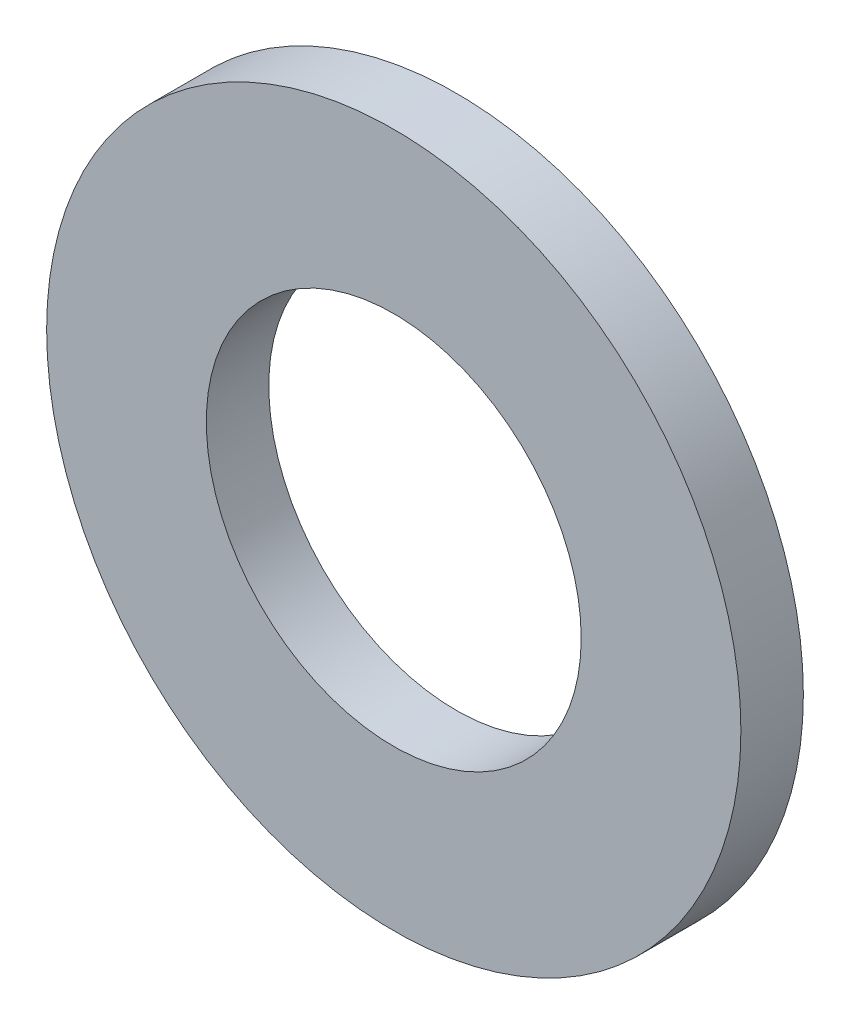
ISO-10303-21;
HEADER;
FILE_DESCRIPTION(('STEP AP214'),'2;1');
FILE_NAME('part.step','',(''),(''),'','','');
FILE_SCHEMA(('AUTOMOTIVE_DESIGN { 1 0 10303 214 1 1 1 1 }'));
ENDSEC;
DATA;
#1=APPLICATION_CONTEXT('core data for automotive mechanical design processes');
#2=APPLICATION_PROTOCOL_DEFINITION('international standard','automotive_design',2000,#1);
#3=PRODUCT_CONTEXT('',#1,'mechanical');
#4=PRODUCT('Part','Part','',(#3));
#5=PRODUCT_RELATED_PRODUCT_CATEGORY('part','',(#4));
#6=PRODUCT_DEFINITION_FORMATION('','',#4);
#7=PRODUCT_DEFINITION_CONTEXT('part definition',#1,'design');
#8=PRODUCT_DEFINITION('design','',#6,#7);
#9=PRODUCT_DEFINITION_SHAPE('','',#8);
#10=(LENGTH_UNIT() NAMED_UNIT(*) SI_UNIT(.MILLI.,.METRE.));
#11=(NAMED_UNIT(*) PLANE_ANGLE_UNIT() SI_UNIT($,.RADIAN.));
#12=(NAMED_UNIT(*) SI_UNIT($,.STERADIAN.) SOLID_ANGLE_UNIT());
#13=UNCERTAINTY_MEASURE_WITH_UNIT(LENGTH_MEASURE(1.E-05),#10,'distance_accuracy_value','');
#14=(GEOMETRIC_REPRESENTATION_CONTEXT(3) GLOBAL_UNCERTAINTY_ASSIGNED_CONTEXT((#13)) GLOBAL_UNIT_ASSIGNED_CONTEXT((#10,
#11,#12)) REPRESENTATION_CONTEXT('',''));
#15=CARTESIAN_POINT('',(0.,0.,0.));
#16=DIRECTION('',(0.,0.,1.));
#17=DIRECTION('',(1.,0.,0.));
#18=AXIS2_PLACEMENT_3D('',#15,#16,#17);
#19=CARTESIAN_POINT('',(0.,0.,0.9));
#20=DIRECTION('',(0.,0.,1.));
#21=DIRECTION('',(1.,0.,0.));
#22=AXIS2_PLACEMENT_3D('',#19,#20,#21);
#23=PLANE('',#22);
#24=CARTESIAN_POINT('',(0.,0.,0.9));
#25=DIRECTION('',(0.,0.,1.));
#26=DIRECTION('',(1.,0.,0.));
#27=AXIS2_PLACEMENT_3D('',#24,#25,#26);
#28=CIRCLE('',#27,5.);
#29=CARTESIAN_POINT('',(5.,0.,0.9));
#30=VERTEX_POINT('',#29);
#31=EDGE_CURVE('E10',#30,#30,#28,.T.);
#32=ORIENTED_EDGE('',*,*,#31,.T.);
#33=EDGE_LOOP('',(#32));
#34=FACE_BOUND('',#33,.T.);
#35=CARTESIAN_POINT('',(0.,0.,0.9));
#36=DIRECTION('',(0.,0.,1.));
#37=DIRECTION('',(1.,0.,0.));
#38=AXIS2_PLACEMENT_3D('',#35,#36,#37);
#39=CIRCLE('',#38,2.7);
#40=CARTESIAN_POINT('',(2.7,0.,0.9));
#41=VERTEX_POINT('',#40);
#42=EDGE_CURVE('E41',#41,#41,#39,.T.);
#43=ORIENTED_EDGE('',*,*,#42,.F.);
#44=EDGE_LOOP('',(#43));
#45=FACE_BOUND('',#44,.T.);
#46=ADVANCED_FACE('F30',(#34,#45),#23,.T.);
#47=CARTESIAN_POINT('',(0.,0.,0.));
#48=DIRECTION('',(0.,0.,1.));
#49=DIRECTION('',(1.,0.,0.));
#50=AXIS2_PLACEMENT_3D('',#47,#48,#49);
#51=PLANE('',#50);
#52=CARTESIAN_POINT('',(0.,0.,0.));
#53=DIRECTION('',(0.,0.,1.));
#54=DIRECTION('',(1.,0.,0.));
#55=AXIS2_PLACEMENT_3D('',#52,#53,#54);
#56=CIRCLE('',#55,5.);
#57=CARTESIAN_POINT('',(5.,0.,0.));
#58=VERTEX_POINT('',#57);
#59=EDGE_CURVE('E34',#58,#58,#56,.T.);
#60=ORIENTED_EDGE('',*,*,#59,.F.);
#61=EDGE_LOOP('',(#60));
#62=FACE_BOUND('',#61,.T.);
#63=CARTESIAN_POINT('',(0.,0.,0.));
#64=DIRECTION('',(0.,0.,1.));
#65=DIRECTION('',(1.,0.,0.));
#66=AXIS2_PLACEMENT_3D('',#63,#64,#65);
#67=CIRCLE('',#66,2.7);
#68=CARTESIAN_POINT('',(2.7,0.,0.));
#69=VERTEX_POINT('',#68);
#70=EDGE_CURVE('E43',#69,#69,#67,.T.);
#71=ORIENTED_EDGE('',*,*,#70,.T.);
#72=EDGE_LOOP('',(#71));
#73=FACE_BOUND('',#72,.T.);
#74=ADVANCED_FACE('F53',(#62,#73),#51,.F.);
#75=CARTESIAN_POINT('',(0.,0.,0.9));
#76=DIRECTION('',(0.,0.,-1.));
#77=DIRECTION('',(-1.,0.,0.));
#78=AXIS2_PLACEMENT_3D('',#75,#76,#77);
#79=CYLINDRICAL_SURFACE('',#78,5.);
#80=ORIENTED_EDGE('',*,*,#31,.F.);
#81=EDGE_LOOP('',(#80));
#82=FACE_BOUND('',#81,.T.);
#83=ORIENTED_EDGE('',*,*,#59,.T.);
#84=EDGE_LOOP('',(#83));
#85=FACE_BOUND('',#84,.T.);
#86=ADVANCED_FACE('F32',(#82,#85),#79,.T.);
#87=CARTESIAN_POINT('',(0.,0.,0.9));
#88=DIRECTION('',(0.,0.,-1.));
#89=DIRECTION('',(-1.,0.,0.));
#90=AXIS2_PLACEMENT_3D('',#87,#88,#89);
#91=CYLINDRICAL_SURFACE('',#90,2.7);
#92=ORIENTED_EDGE('',*,*,#42,.T.);
#93=EDGE_LOOP('',(#92));
#94=FACE_BOUND('',#93,.T.);
#95=ORIENTED_EDGE('',*,*,#70,.F.);
#96=EDGE_LOOP('',(#95));
#97=FACE_BOUND('',#96,.T.);
#98=ADVANCED_FACE('F49',(#94,#97),#91,.F.);
#99=CLOSED_SHELL('',(#46,#74,#86,#98));
#100=MANIFOLD_SOLID_BREP('B2',#99);
#101=ADVANCED_BREP_SHAPE_REPRESENTATION('',(#18,#100),#14);
#102=SHAPE_DEFINITION_REPRESENTATION(#9,#101);
ENDSEC;
END-ISO-10303-21;
